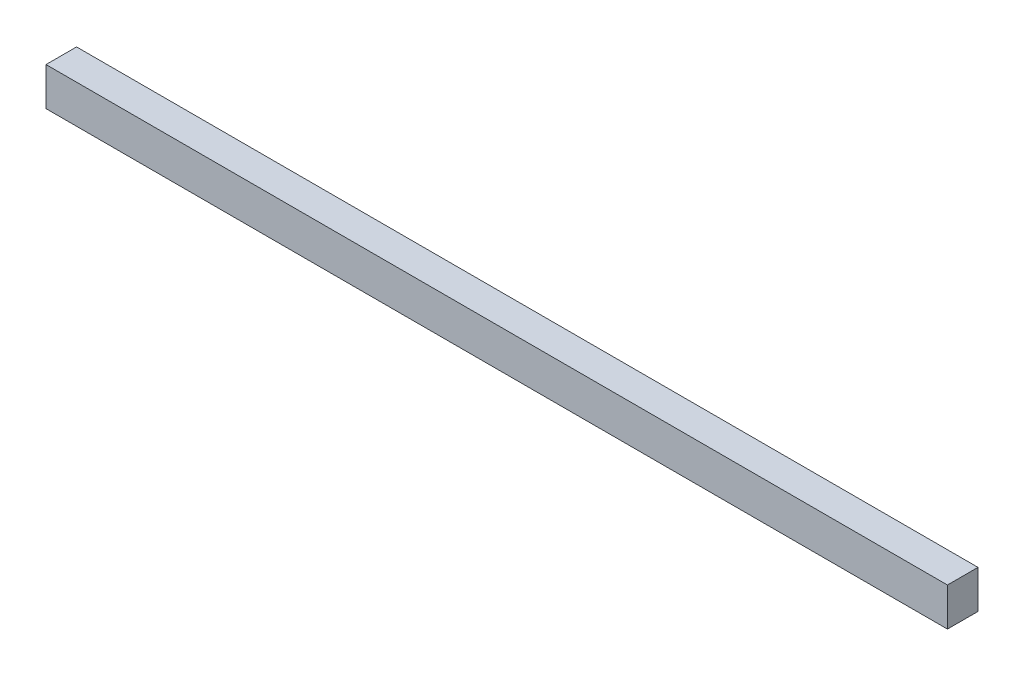
ISO-10303-21;
HEADER;
FILE_DESCRIPTION(('STEP AP214'),'2;1');
FILE_NAME('part.step','',(''),(''),'','','');
FILE_SCHEMA(('AUTOMOTIVE_DESIGN { 1 0 10303 214 1 1 1 1 }'));
ENDSEC;
DATA;
#1=APPLICATION_CONTEXT('core data for automotive mechanical design processes');
#2=APPLICATION_PROTOCOL_DEFINITION('international standard','automotive_design',2000,#1);
#3=PRODUCT_CONTEXT('',#1,'mechanical');
#4=PRODUCT('Part','Part','',(#3));
#5=PRODUCT_RELATED_PRODUCT_CATEGORY('part','',(#4));
#6=PRODUCT_DEFINITION_FORMATION('','',#4);
#7=PRODUCT_DEFINITION_CONTEXT('part definition',#1,'design');
#8=PRODUCT_DEFINITION('design','',#6,#7);
#9=PRODUCT_DEFINITION_SHAPE('','',#8);
#10=(LENGTH_UNIT() NAMED_UNIT(*) SI_UNIT(.MILLI.,.METRE.));
#11=(NAMED_UNIT(*) PLANE_ANGLE_UNIT() SI_UNIT($,.RADIAN.));
#12=(NAMED_UNIT(*) SI_UNIT($,.STERADIAN.) SOLID_ANGLE_UNIT());
#13=UNCERTAINTY_MEASURE_WITH_UNIT(LENGTH_MEASURE(1.E-05),#10,'distance_accuracy_value','');
#14=(GEOMETRIC_REPRESENTATION_CONTEXT(3) GLOBAL_UNCERTAINTY_ASSIGNED_CONTEXT((#13)) GLOBAL_UNIT_ASSIGNED_CONTEXT((#10,
#11,#12)) REPRESENTATION_CONTEXT('',''));
#15=CARTESIAN_POINT('',(0.,0.,0.));
#16=DIRECTION('',(0.,0.,1.));
#17=DIRECTION('',(1.,0.,0.));
#18=AXIS2_PLACEMENT_3D('',#15,#16,#17);
#19=CARTESIAN_POINT('',(25.,0.,40.));
#20=DIRECTION('',(1.,0.,0.));
#21=DIRECTION('',(0.,0.,-1.));
#22=AXIS2_PLACEMENT_3D('',#19,#20,#21);
#23=PLANE('',#22);
#24=DIRECTION('',(0.,-1.,0.));
#25=VECTOR('',#24,1.);
#26=CARTESIAN_POINT('',(25.,0.,20.));
#27=LINE('',#26,#25);
#28=CARTESIAN_POINT('',(25.,25.,20.));
#29=VERTEX_POINT('',#28);
#30=CARTESIAN_POINT('',(25.,0.,20.));
#31=VERTEX_POINT('',#30);
#32=EDGE_CURVE('E102',#29,#31,#27,.T.);
#33=ORIENTED_EDGE('',*,*,#32,.T.);
#34=DIRECTION('',(0.,0.,-1.));
#35=VECTOR('',#34,1.);
#36=CARTESIAN_POINT('',(25.,0.,40.));
#37=LINE('',#36,#35);
#38=CARTESIAN_POINT('',(25.,0.,40.));
#39=VERTEX_POINT('',#38);
#40=EDGE_CURVE('E11',#39,#31,#37,.T.);
#41=ORIENTED_EDGE('',*,*,#40,.F.);
#42=DIRECTION('',(0.,-1.,0.));
#43=VECTOR('',#42,1.);
#44=CARTESIAN_POINT('',(25.,0.,40.));
#45=LINE('',#44,#43);
#46=CARTESIAN_POINT('',(25.,25.,40.));
#47=VERTEX_POINT('',#46);
#48=EDGE_CURVE('E90',#47,#39,#45,.T.);
#49=ORIENTED_EDGE('',*,*,#48,.F.);
#50=DIRECTION('',(0.,0.,-1.));
#51=VECTOR('',#50,1.);
#52=CARTESIAN_POINT('',(25.,25.,40.));
#53=LINE('',#52,#51);
#54=EDGE_CURVE('E98',#47,#29,#53,.T.);
#55=ORIENTED_EDGE('',*,*,#54,.T.);
#56=EDGE_LOOP('',(#33,#41,#49,#55));
#57=FACE_BOUND('',#56,.T.);
#58=ADVANCED_FACE('F39',(#57),#23,.F.);
#59=CARTESIAN_POINT('',(25.,0.,40.));
#60=DIRECTION('',(0.,1.,0.));
#61=DIRECTION('',(0.,0.,1.));
#62=AXIS2_PLACEMENT_3D('',#59,#60,#61);
#63=PLANE('',#62);
#64=DIRECTION('',(1.,0.,0.));
#65=VECTOR('',#64,1.);
#66=CARTESIAN_POINT('',(25.,0.,20.));
#67=LINE('',#66,#65);
#68=CARTESIAN_POINT('',(615.,0.,20.));
#69=VERTEX_POINT('',#68);
#70=EDGE_CURVE('E94',#31,#69,#67,.T.);
#71=ORIENTED_EDGE('',*,*,#70,.T.);
#72=DIRECTION('',(0.,0.,-1.));
#73=VECTOR('',#72,1.);
#74=CARTESIAN_POINT('',(615.,0.,40.));
#75=LINE('',#74,#73);
#76=CARTESIAN_POINT('',(615.,0.,40.));
#77=VERTEX_POINT('',#76);
#78=EDGE_CURVE('E47',#77,#69,#75,.T.);
#79=ORIENTED_EDGE('',*,*,#78,.F.);
#80=DIRECTION('',(1.,0.,0.));
#81=VECTOR('',#80,1.);
#82=CARTESIAN_POINT('',(25.,0.,40.));
#83=LINE('',#82,#81);
#84=EDGE_CURVE('E85',#39,#77,#83,.T.);
#85=ORIENTED_EDGE('',*,*,#84,.F.);
#86=ORIENTED_EDGE('',*,*,#40,.T.);
#87=EDGE_LOOP('',(#71,#79,#85,#86));
#88=FACE_BOUND('',#87,.T.);
#89=ADVANCED_FACE('F93',(#88),#63,.F.);
#90=CARTESIAN_POINT('',(615.,0.,40.));
#91=DIRECTION('',(-1.,0.,0.));
#92=DIRECTION('',(0.,0.,1.));
#93=AXIS2_PLACEMENT_3D('',#90,#91,#92);
#94=PLANE('',#93);
#95=DIRECTION('',(0.,1.,0.));
#96=VECTOR('',#95,1.);
#97=CARTESIAN_POINT('',(615.,0.,20.));
#98=LINE('',#97,#96);
#99=CARTESIAN_POINT('',(615.,25.,20.));
#100=VERTEX_POINT('',#99);
#101=EDGE_CURVE('E72',#69,#100,#98,.T.);
#102=ORIENTED_EDGE('',*,*,#101,.T.);
#103=DIRECTION('',(0.,0.,-1.));
#104=VECTOR('',#103,1.);
#105=CARTESIAN_POINT('',(615.,25.,40.));
#106=LINE('',#105,#104);
#107=CARTESIAN_POINT('',(615.,25.,40.));
#108=VERTEX_POINT('',#107);
#109=EDGE_CURVE('E95',#108,#100,#106,.T.);
#110=ORIENTED_EDGE('',*,*,#109,.F.);
#111=DIRECTION('',(0.,1.,0.));
#112=VECTOR('',#111,1.);
#113=CARTESIAN_POINT('',(615.,0.,40.));
#114=LINE('',#113,#112);
#115=EDGE_CURVE('E88',#77,#108,#114,.T.);
#116=ORIENTED_EDGE('',*,*,#115,.F.);
#117=ORIENTED_EDGE('',*,*,#78,.T.);
#118=EDGE_LOOP('',(#102,#110,#116,#117));
#119=FACE_BOUND('',#118,.T.);
#120=ADVANCED_FACE('F96',(#119),#94,.F.);
#121=CARTESIAN_POINT('',(25.,25.,40.));
#122=DIRECTION('',(0.,-1.,0.));
#123=DIRECTION('',(0.,0.,-1.));
#124=AXIS2_PLACEMENT_3D('',#121,#122,#123);
#125=PLANE('',#124);
#126=DIRECTION('',(-1.,0.,0.));
#127=VECTOR('',#126,1.);
#128=CARTESIAN_POINT('',(25.,25.,20.));
#129=LINE('',#128,#127);
#130=EDGE_CURVE('E78',#100,#29,#129,.T.);
#131=ORIENTED_EDGE('',*,*,#130,.T.);
#132=ORIENTED_EDGE('',*,*,#54,.F.);
#133=DIRECTION('',(-1.,0.,0.));
#134=VECTOR('',#133,1.);
#135=CARTESIAN_POINT('',(25.,25.,40.));
#136=LINE('',#135,#134);
#137=EDGE_CURVE('E55',#108,#47,#136,.T.);
#138=ORIENTED_EDGE('',*,*,#137,.F.);
#139=ORIENTED_EDGE('',*,*,#109,.T.);
#140=EDGE_LOOP('',(#131,#132,#138,#139));
#141=FACE_BOUND('',#140,.T.);
#142=ADVANCED_FACE('F109',(#141),#125,.F.);
#143=CARTESIAN_POINT('',(0.,0.,40.));
#144=DIRECTION('',(0.,0.,-1.));
#145=DIRECTION('',(-1.,0.,0.));
#146=AXIS2_PLACEMENT_3D('',#143,#144,#145);
#147=PLANE('',#146);
#148=ORIENTED_EDGE('',*,*,#48,.T.);
#149=ORIENTED_EDGE('',*,*,#84,.T.);
#150=ORIENTED_EDGE('',*,*,#115,.T.);
#151=ORIENTED_EDGE('',*,*,#137,.T.);
#152=EDGE_LOOP('',(#148,#149,#150,#151));
#153=FACE_BOUND('',#152,.T.);
#154=ADVANCED_FACE('F86',(#153),#147,.F.);
#155=CARTESIAN_POINT('',(0.,0.,20.));
#156=DIRECTION('',(0.,0.,-1.));
#157=DIRECTION('',(-1.,0.,0.));
#158=AXIS2_PLACEMENT_3D('',#155,#156,#157);
#159=PLANE('',#158);
#160=ORIENTED_EDGE('',*,*,#32,.F.);
#161=ORIENTED_EDGE('',*,*,#130,.F.);
#162=ORIENTED_EDGE('',*,*,#101,.F.);
#163=ORIENTED_EDGE('',*,*,#70,.F.);
#164=EDGE_LOOP('',(#160,#161,#162,#163));
#165=FACE_BOUND('',#164,.T.);
#166=ADVANCED_FACE('F112',(#165),#159,.T.);
#167=CLOSED_SHELL('',(#58,#89,#120,#142,#154,#166));
#168=MANIFOLD_SOLID_BREP('B2',#167);
#169=ADVANCED_BREP_SHAPE_REPRESENTATION('',(#18,#168),#14);
#170=SHAPE_DEFINITION_REPRESENTATION(#9,#169);
ENDSEC;
END-ISO-10303-21;
